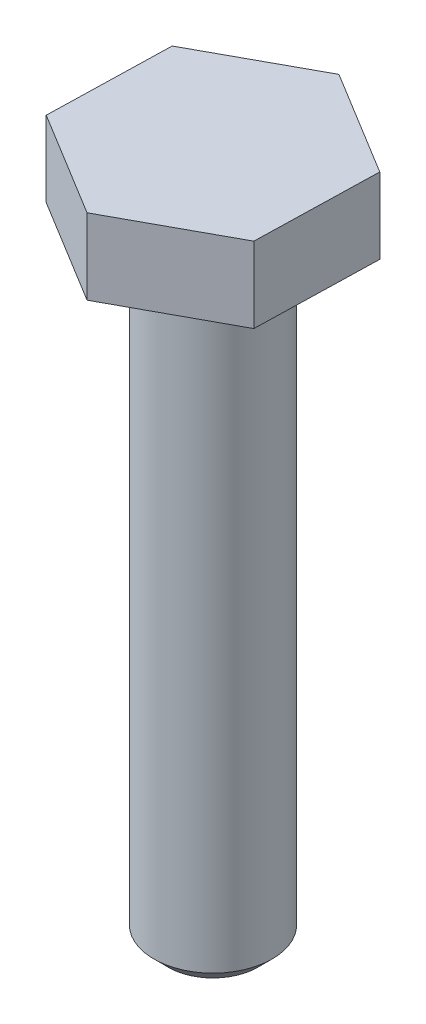
ISO-10303-21;
HEADER;
FILE_DESCRIPTION(('STEP AP214'),'2;1');
FILE_NAME('part.step','',(''),(''),'','','');
FILE_SCHEMA(('AUTOMOTIVE_DESIGN { 1 0 10303 214 1 1 1 1 }'));
ENDSEC;
DATA;
#1=APPLICATION_CONTEXT('core data for automotive mechanical design processes');
#2=APPLICATION_PROTOCOL_DEFINITION('international standard','automotive_design',2000,#1);
#3=PRODUCT_CONTEXT('',#1,'mechanical');
#4=PRODUCT('Part','Part','',(#3));
#5=PRODUCT_RELATED_PRODUCT_CATEGORY('part','',(#4));
#6=PRODUCT_DEFINITION_FORMATION('','',#4);
#7=PRODUCT_DEFINITION_CONTEXT('part definition',#1,'design');
#8=PRODUCT_DEFINITION('design','',#6,#7);
#9=PRODUCT_DEFINITION_SHAPE('','',#8);
#10=(LENGTH_UNIT() NAMED_UNIT(*) SI_UNIT(.MILLI.,.METRE.));
#11=(NAMED_UNIT(*) PLANE_ANGLE_UNIT() SI_UNIT($,.RADIAN.));
#12=(NAMED_UNIT(*) SI_UNIT($,.STERADIAN.) SOLID_ANGLE_UNIT());
#13=UNCERTAINTY_MEASURE_WITH_UNIT(LENGTH_MEASURE(1.E-05),#10,'distance_accuracy_value','');
#14=(GEOMETRIC_REPRESENTATION_CONTEXT(3) GLOBAL_UNCERTAINTY_ASSIGNED_CONTEXT((#13)) GLOBAL_UNIT_ASSIGNED_CONTEXT((#10,
#11,#12)) REPRESENTATION_CONTEXT('',''));
#15=CARTESIAN_POINT('',(0.,0.,0.));
#16=DIRECTION('',(0.,0.,1.));
#17=DIRECTION('',(1.,0.,0.));
#18=AXIS2_PLACEMENT_3D('',#15,#16,#17);
#19=CARTESIAN_POINT('',(-0.163427345467682,4.064,6.59708962367144));
#20=DIRECTION('',(-0.478399491420882,0.,-0.87814231569162));
#21=DIRECTION('',(-0.878142315691621,0.,0.478399491420882));
#22=AXIS2_PLACEMENT_3D('',#19,#20,#21);
#23=PLANE('',#22);
#24=DIRECTION('',(0.87814231569162,0.,-0.478399491420882));
#25=VECTOR('',#24,1.);
#26=CARTESIAN_POINT('',(-0.163427345467682,0.,6.59708962367144));
#27=LINE('',#26,#25);
#28=CARTESIAN_POINT('',(-0.163427345467682,0.,6.59708962367144));
#29=VERTEX_POINT('',#28);
#30=CARTESIAN_POINT('',(5.63153353240836,0.,3.44007704468377));
#31=VERTEX_POINT('',#30);
#32=EDGE_CURVE('E122',#29,#31,#27,.T.);
#33=ORIENTED_EDGE('',*,*,#32,.T.);
#34=DIRECTION('',(0.,-1.,0.));
#35=VECTOR('',#34,1.);
#36=CARTESIAN_POINT('',(5.63153353240836,4.064,3.44007704468377));
#37=LINE('',#36,#35);
#38=CARTESIAN_POINT('',(5.63153353240836,4.064,3.44007704468377));
#39=VERTEX_POINT('',#38);
#40=EDGE_CURVE('E139',#39,#31,#37,.T.);
#41=ORIENTED_EDGE('',*,*,#40,.F.);
#42=DIRECTION('',(0.87814231569162,0.,-0.478399491420882));
#43=VECTOR('',#42,1.);
#44=CARTESIAN_POINT('',(-0.163427345467682,4.064,6.59708962367144));
#45=LINE('',#44,#43);
#46=CARTESIAN_POINT('',(-0.163427345467682,4.064,6.59708962367144));
#47=VERTEX_POINT('',#46);
#48=EDGE_CURVE('E132',#47,#39,#45,.T.);
#49=ORIENTED_EDGE('',*,*,#48,.F.);
#50=DIRECTION('',(0.,-1.,0.));
#51=VECTOR('',#50,1.);
#52=CARTESIAN_POINT('',(-0.163427345467682,4.064,6.59708962367144));
#53=LINE('',#52,#51);
#54=EDGE_CURVE('E118',#47,#29,#53,.T.);
#55=ORIENTED_EDGE('',*,*,#54,.T.);
#56=EDGE_LOOP('',(#33,#41,#49,#55));
#57=FACE_BOUND('',#56,.T.);
#58=ADVANCED_FACE('F36',(#57),#23,.F.);
#59=CARTESIAN_POINT('',(5.63153353240836,4.064,3.44007704468377));
#60=DIRECTION('',(-0.999693299237479,0.,-0.0247650451177693));
#61=DIRECTION('',(-0.0247650451177693,0.,0.999693299237479));
#62=AXIS2_PLACEMENT_3D('',#59,#60,#61);
#63=PLANE('',#62);
#64=DIRECTION('',(0.0247650451177693,0.,-0.999693299237479));
#65=VECTOR('',#64,1.);
#66=CARTESIAN_POINT('',(5.63153353240836,0.,3.44007704468377));
#67=LINE('',#66,#65);
#68=CARTESIAN_POINT('',(5.79496087787603,0.,-3.15701257898765));
#69=VERTEX_POINT('',#68);
#70=EDGE_CURVE('E125',#31,#69,#67,.T.);
#71=ORIENTED_EDGE('',*,*,#70,.T.);
#72=DIRECTION('',(0.,-1.,0.));
#73=VECTOR('',#72,1.);
#74=CARTESIAN_POINT('',(5.79496087787603,4.064,-3.15701257898765));
#75=LINE('',#74,#73);
#76=CARTESIAN_POINT('',(5.79496087787603,4.064,-3.15701257898765));
#77=VERTEX_POINT('',#76);
#78=EDGE_CURVE('E136',#77,#69,#75,.T.);
#79=ORIENTED_EDGE('',*,*,#78,.F.);
#80=DIRECTION('',(0.0247650451177693,0.,-0.999693299237479));
#81=VECTOR('',#80,1.);
#82=CARTESIAN_POINT('',(5.63153353240836,4.064,3.44007704468377));
#83=LINE('',#82,#81);
#84=EDGE_CURVE('E91',#39,#77,#83,.T.);
#85=ORIENTED_EDGE('',*,*,#84,.F.);
#86=ORIENTED_EDGE('',*,*,#40,.T.);
#87=EDGE_LOOP('',(#71,#79,#85,#86));
#88=FACE_BOUND('',#87,.T.);
#89=ADVANCED_FACE('F152',(#88),#63,.F.);
#90=CARTESIAN_POINT('',(5.79496087787603,4.064,-3.15701257898765));
#91=DIRECTION('',(-0.521293807816597,0.,0.853377270573849));
#92=DIRECTION('',(0.853377270573849,0.,0.521293807816597));
#93=AXIS2_PLACEMENT_3D('',#90,#91,#92);
#94=PLANE('',#93);
#95=DIRECTION('',(-0.853377270573849,0.,-0.521293807816597));
#96=VECTOR('',#95,1.);
#97=CARTESIAN_POINT('',(5.79496087787603,0.,-3.15701257898765));
#98=LINE('',#97,#96);
#99=CARTESIAN_POINT('',(0.163427345467676,0.,-6.59708962367143));
#100=VERTEX_POINT('',#99);
#101=EDGE_CURVE('E127',#69,#100,#98,.T.);
#102=ORIENTED_EDGE('',*,*,#101,.T.);
#103=DIRECTION('',(0.,-1.,0.));
#104=VECTOR('',#103,1.);
#105=CARTESIAN_POINT('',(0.163427345467676,4.064,-6.59708962367143));
#106=LINE('',#105,#104);
#107=CARTESIAN_POINT('',(0.163427345467676,4.064,-6.59708962367143));
#108=VERTEX_POINT('',#107);
#109=EDGE_CURVE('E113',#108,#100,#106,.T.);
#110=ORIENTED_EDGE('',*,*,#109,.F.);
#111=DIRECTION('',(-0.853377270573849,0.,-0.521293807816597));
#112=VECTOR('',#111,1.);
#113=CARTESIAN_POINT('',(5.79496087787603,4.064,-3.15701257898765));
#114=LINE('',#113,#112);
#115=EDGE_CURVE('E104',#77,#108,#114,.T.);
#116=ORIENTED_EDGE('',*,*,#115,.F.);
#117=ORIENTED_EDGE('',*,*,#78,.T.);
#118=EDGE_LOOP('',(#102,#110,#116,#117));
#119=FACE_BOUND('',#118,.T.);
#120=ADVANCED_FACE('F155',(#119),#94,.F.);
#121=CARTESIAN_POINT('',(0.163427345467676,4.064,-6.59708962367143));
#122=DIRECTION('',(0.478399491420882,0.,0.87814231569162));
#123=DIRECTION('',(0.87814231569162,0.,-0.478399491420882));
#124=AXIS2_PLACEMENT_3D('',#121,#122,#123);
#125=PLANE('',#124);
#126=DIRECTION('',(-0.87814231569162,0.,0.478399491420882));
#127=VECTOR('',#126,1.);
#128=CARTESIAN_POINT('',(0.163427345467676,0.,-6.59708962367143));
#129=LINE('',#128,#127);
#130=CARTESIAN_POINT('',(-5.63153353240835,0.,-3.44007704468377));
#131=VERTEX_POINT('',#130);
#132=EDGE_CURVE('E112',#100,#131,#129,.T.);
#133=ORIENTED_EDGE('',*,*,#132,.T.);
#134=DIRECTION('',(0.,-1.,0.));
#135=VECTOR('',#134,1.);
#136=CARTESIAN_POINT('',(-5.63153353240835,4.064,-3.44007704468377));
#137=LINE('',#136,#135);
#138=CARTESIAN_POINT('',(-5.63153353240835,4.064,-3.44007704468377));
#139=VERTEX_POINT('',#138);
#140=EDGE_CURVE('E109',#139,#131,#137,.T.);
#141=ORIENTED_EDGE('',*,*,#140,.F.);
#142=DIRECTION('',(-0.87814231569162,0.,0.478399491420882));
#143=VECTOR('',#142,1.);
#144=CARTESIAN_POINT('',(0.163427345467676,4.064,-6.59708962367143));
#145=LINE('',#144,#143);
#146=EDGE_CURVE('E98',#108,#139,#145,.T.);
#147=ORIENTED_EDGE('',*,*,#146,.F.);
#148=ORIENTED_EDGE('',*,*,#109,.T.);
#149=EDGE_LOOP('',(#133,#141,#147,#148));
#150=FACE_BOUND('',#149,.T.);
#151=ADVANCED_FACE('F110',(#150),#125,.F.);
#152=CARTESIAN_POINT('',(-5.63153353240835,4.064,-3.44007704468377));
#153=DIRECTION('',(0.999693299237479,0.,0.0247650451177692));
#154=DIRECTION('',(0.0247650451177692,0.,-0.999693299237479));
#155=AXIS2_PLACEMENT_3D('',#152,#153,#154);
#156=PLANE('',#155);
#157=DIRECTION('',(-0.0247650451177692,0.,0.999693299237479));
#158=VECTOR('',#157,1.);
#159=CARTESIAN_POINT('',(-5.63153353240835,0.,-3.44007704468377));
#160=LINE('',#159,#158);
#161=CARTESIAN_POINT('',(-5.79496087787601,0.,3.15701257898767));
#162=VERTEX_POINT('',#161);
#163=EDGE_CURVE('E76',#131,#162,#160,.T.);
#164=ORIENTED_EDGE('',*,*,#163,.T.);
#165=DIRECTION('',(0.,-1.,0.));
#166=VECTOR('',#165,1.);
#167=CARTESIAN_POINT('',(-5.79496087787601,4.064,3.15701257898767));
#168=LINE('',#167,#166);
#169=CARTESIAN_POINT('',(-5.79496087787601,4.064,3.15701257898767));
#170=VERTEX_POINT('',#169);
#171=EDGE_CURVE('E114',#170,#162,#168,.T.);
#172=ORIENTED_EDGE('',*,*,#171,.F.);
#173=DIRECTION('',(-0.0247650451177692,0.,0.999693299237479));
#174=VECTOR('',#173,1.);
#175=CARTESIAN_POINT('',(-5.63153353240835,4.064,-3.44007704468377));
#176=LINE('',#175,#174);
#177=EDGE_CURVE('E102',#139,#170,#176,.T.);
#178=ORIENTED_EDGE('',*,*,#177,.F.);
#179=ORIENTED_EDGE('',*,*,#140,.T.);
#180=EDGE_LOOP('',(#164,#172,#178,#179));
#181=FACE_BOUND('',#180,.T.);
#182=ADVANCED_FACE('F116',(#181),#156,.F.);
#183=CARTESIAN_POINT('',(-5.79496087787601,4.064,3.15701257898767));
#184=DIRECTION('',(0.521293807816597,0.,-0.853377270573849));
#185=DIRECTION('',(-0.853377270573849,0.,-0.521293807816597));
#186=AXIS2_PLACEMENT_3D('',#183,#184,#185);
#187=PLANE('',#186);
#188=DIRECTION('',(0.853377270573849,0.,0.521293807816597));
#189=VECTOR('',#188,1.);
#190=CARTESIAN_POINT('',(-5.79496087787601,0.,3.15701257898767));
#191=LINE('',#190,#189);
#192=EDGE_CURVE('E82',#162,#29,#191,.T.);
#193=ORIENTED_EDGE('',*,*,#192,.T.);
#194=ORIENTED_EDGE('',*,*,#54,.F.);
#195=DIRECTION('',(0.853377270573849,0.,0.521293807816597));
#196=VECTOR('',#195,1.);
#197=CARTESIAN_POINT('',(-5.79496087787601,4.064,3.15701257898767));
#198=LINE('',#197,#196);
#199=EDGE_CURVE('E53',#170,#47,#198,.T.);
#200=ORIENTED_EDGE('',*,*,#199,.F.);
#201=ORIENTED_EDGE('',*,*,#171,.T.);
#202=EDGE_LOOP('',(#193,#194,#200,#201));
#203=FACE_BOUND('',#202,.T.);
#204=ADVANCED_FACE('F160',(#203),#187,.F.);
#205=CARTESIAN_POINT('',(0.,4.064,0.));
#206=DIRECTION('',(0.,1.,0.));
#207=DIRECTION('',(0.,0.,1.));
#208=AXIS2_PLACEMENT_3D('',#205,#206,#207);
#209=PLANE('',#208);
#210=ORIENTED_EDGE('',*,*,#48,.T.);
#211=ORIENTED_EDGE('',*,*,#84,.T.);
#212=ORIENTED_EDGE('',*,*,#115,.T.);
#213=ORIENTED_EDGE('',*,*,#146,.T.);
#214=ORIENTED_EDGE('',*,*,#177,.T.);
#215=ORIENTED_EDGE('',*,*,#199,.T.);
#216=EDGE_LOOP('',(#210,#211,#212,#213,#214,#215));
#217=FACE_BOUND('',#216,.T.);
#218=ADVANCED_FACE('F100',(#217),#209,.T.);
#219=CARTESIAN_POINT('',(0.,0.,0.));
#220=DIRECTION('',(0.,1.,0.));
#221=DIRECTION('',(0.,0.,1.));
#222=AXIS2_PLACEMENT_3D('',#219,#220,#221);
#223=PLANE('',#222);
#224=CARTESIAN_POINT('',(0.,0.,0.));
#225=DIRECTION('',(0.,-1.,0.));
#226=DIRECTION('',(0.,0.,-1.));
#227=AXIS2_PLACEMENT_3D('',#224,#225,#226);
#228=CIRCLE('',#227,3.175);
#229=CARTESIAN_POINT('',(0.,0.,-3.175));
#230=VERTEX_POINT('',#229);
#231=EDGE_CURVE('E140',#230,#230,#228,.T.);
#232=ORIENTED_EDGE('',*,*,#231,.F.);
#233=EDGE_LOOP('',(#232));
#234=FACE_BOUND('',#233,.T.);
#235=ORIENTED_EDGE('',*,*,#32,.F.);
#236=ORIENTED_EDGE('',*,*,#192,.F.);
#237=ORIENTED_EDGE('',*,*,#163,.F.);
#238=ORIENTED_EDGE('',*,*,#132,.F.);
#239=ORIENTED_EDGE('',*,*,#101,.F.);
#240=ORIENTED_EDGE('',*,*,#70,.F.);
#241=EDGE_LOOP('',(#235,#236,#237,#238,#239,#240));
#242=FACE_BOUND('',#241,.T.);
#243=ADVANCED_FACE('F158',(#234,#242),#223,.F.);
#244=CARTESIAN_POINT('',(0.,-33.02,0.));
#245=DIRECTION('',(0.,1.,0.));
#246=DIRECTION('',(0.,0.,1.));
#247=AXIS2_PLACEMENT_3D('',#244,#245,#246);
#248=CYLINDRICAL_SURFACE('',#247,3.175);
#249=CARTESIAN_POINT('',(0.,-32.258,0.));
#250=DIRECTION('',(0.,-1.,0.));
#251=DIRECTION('',(0.,0.,-1.));
#252=AXIS2_PLACEMENT_3D('',#249,#250,#251);
#253=CIRCLE('',#252,3.175);
#254=CARTESIAN_POINT('',(0.,-32.258,-3.175));
#255=VERTEX_POINT('',#254);
#256=EDGE_CURVE('E11',#255,#255,#253,.F.);
#257=ORIENTED_EDGE('',*,*,#256,.T.);
#258=EDGE_LOOP('',(#257));
#259=FACE_BOUND('',#258,.T.);
#260=ORIENTED_EDGE('',*,*,#231,.T.);
#261=EDGE_LOOP('',(#260));
#262=FACE_BOUND('',#261,.T.);
#263=ADVANCED_FACE('F206',(#259,#262),#248,.T.);
#264=CARTESIAN_POINT('',(0.,-33.02,0.));
#265=DIRECTION('',(0.,-1.,0.));
#266=DIRECTION('',(0.,0.,-1.));
#267=AXIS2_PLACEMENT_3D('',#264,#265,#266);
#268=PLANE('',#267);
#269=CARTESIAN_POINT('',(0.,-33.02,0.));
#270=DIRECTION('',(0.,-1.,0.));
#271=DIRECTION('',(0.,0.,-1.));
#272=AXIS2_PLACEMENT_3D('',#269,#270,#271);
#273=CIRCLE('',#272,2.41300000000001);
#274=CARTESIAN_POINT('',(0.,-33.02,-2.41300000000001));
#275=VERTEX_POINT('',#274);
#276=EDGE_CURVE('E45',#275,#275,#273,.T.);
#277=ORIENTED_EDGE('',*,*,#276,.T.);
#278=EDGE_LOOP('',(#277));
#279=FACE_BOUND('',#278,.T.);
#280=ADVANCED_FACE('F215',(#279),#268,.T.);
#281=CARTESIAN_POINT('',(0.,-33.02,0.));
#282=DIRECTION('',(0.,1.,0.));
#283=DIRECTION('',(0.,0.,1.));
#284=AXIS2_PLACEMENT_3D('',#281,#282,#283);
#285=CONICAL_SURFACE('',#284,2.41300000000001,0.785398163397448);
#286=ORIENTED_EDGE('',*,*,#256,.F.);
#287=EDGE_LOOP('',(#286));
#288=FACE_BOUND('',#287,.T.);
#289=ORIENTED_EDGE('',*,*,#276,.F.);
#290=EDGE_LOOP('',(#289));
#291=FACE_BOUND('',#290,.T.);
#292=ADVANCED_FACE('F38',(#288,#291),#285,.T.);
#293=CLOSED_SHELL('',(#58,#89,#120,#151,#182,#204,#218,#243,#263,#280,#292));
#294=MANIFOLD_SOLID_BREP('B2',#293);
#295=ADVANCED_BREP_SHAPE_REPRESENTATION('',(#18,#294),#14);
#296=SHAPE_DEFINITION_REPRESENTATION(#9,#295);
ENDSEC;
END-ISO-10303-21;
